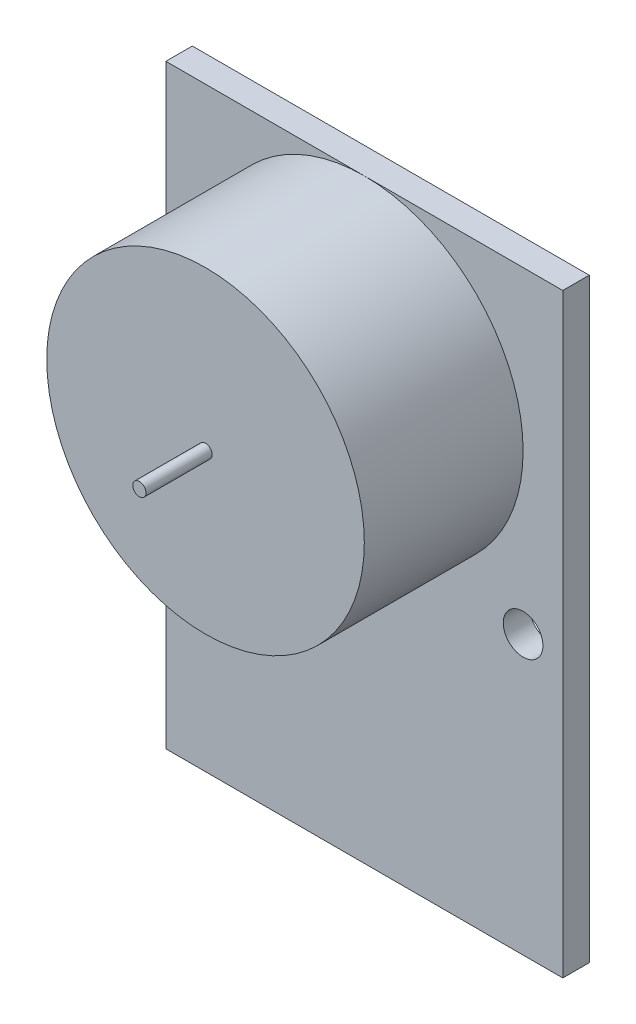
ISO-10303-21;
HEADER;
FILE_DESCRIPTION(('STEP AP214'),'2;1');
FILE_NAME('part.step','',(''),(''),'','','');
FILE_SCHEMA(('AUTOMOTIVE_DESIGN { 1 0 10303 214 1 1 1 1 }'));
ENDSEC;
DATA;
#1=APPLICATION_CONTEXT('core data for automotive mechanical design processes');
#2=APPLICATION_PROTOCOL_DEFINITION('international standard','automotive_design',2000,#1);
#3=PRODUCT_CONTEXT('',#1,'mechanical');
#4=PRODUCT('Part','Part','',(#3));
#5=PRODUCT_RELATED_PRODUCT_CATEGORY('part','',(#4));
#6=PRODUCT_DEFINITION_FORMATION('','',#4);
#7=PRODUCT_DEFINITION_CONTEXT('part definition',#1,'design');
#8=PRODUCT_DEFINITION('design','',#6,#7);
#9=PRODUCT_DEFINITION_SHAPE('','',#8);
#10=(LENGTH_UNIT() NAMED_UNIT(*) SI_UNIT(.MILLI.,.METRE.));
#11=(NAMED_UNIT(*) PLANE_ANGLE_UNIT() SI_UNIT($,.RADIAN.));
#12=(NAMED_UNIT(*) SI_UNIT($,.STERADIAN.) SOLID_ANGLE_UNIT());
#13=UNCERTAINTY_MEASURE_WITH_UNIT(LENGTH_MEASURE(1.E-05),#10,'distance_accuracy_value','');
#14=(GEOMETRIC_REPRESENTATION_CONTEXT(3) GLOBAL_UNCERTAINTY_ASSIGNED_CONTEXT((#13)) GLOBAL_UNIT_ASSIGNED_CONTEXT((#10,
#11,#12)) REPRESENTATION_CONTEXT('',''));
#15=CARTESIAN_POINT('',(0.,0.,0.));
#16=DIRECTION('',(0.,0.,1.));
#17=DIRECTION('',(1.,0.,0.));
#18=AXIS2_PLACEMENT_3D('',#15,#16,#17);
#19=CARTESIAN_POINT('',(15.,-22.5,-2.));
#20=DIRECTION('',(1.,0.,0.));
#21=DIRECTION('',(0.,0.,-1.));
#22=AXIS2_PLACEMENT_3D('',#19,#20,#21);
#23=PLANE('',#22);
#24=DIRECTION('',(0.,1.,0.));
#25=VECTOR('',#24,1.);
#26=CARTESIAN_POINT('',(15.,-22.5,0.));
#27=LINE('',#26,#25);
#28=CARTESIAN_POINT('',(15.,-22.5,0.));
#29=VERTEX_POINT('',#28);
#30=CARTESIAN_POINT('',(15.,22.5,0.));
#31=VERTEX_POINT('',#30);
#32=EDGE_CURVE('E93',#29,#31,#27,.T.);
#33=ORIENTED_EDGE('',*,*,#32,.F.);
#34=DIRECTION('',(0.,0.,1.));
#35=VECTOR('',#34,1.);
#36=CARTESIAN_POINT('',(15.,-22.5,-2.));
#37=LINE('',#36,#35);
#38=CARTESIAN_POINT('',(15.,-22.5,-2.));
#39=VERTEX_POINT('',#38);
#40=EDGE_CURVE('E11',#39,#29,#37,.T.);
#41=ORIENTED_EDGE('',*,*,#40,.F.);
#42=DIRECTION('',(0.,1.,0.));
#43=VECTOR('',#42,1.);
#44=CARTESIAN_POINT('',(15.,-22.5,-2.));
#45=LINE('',#44,#43);
#46=CARTESIAN_POINT('',(15.,22.5,-2.));
#47=VERTEX_POINT('',#46);
#48=EDGE_CURVE('E106',#39,#47,#45,.T.);
#49=ORIENTED_EDGE('',*,*,#48,.T.);
#50=DIRECTION('',(0.,0.,1.));
#51=VECTOR('',#50,1.);
#52=CARTESIAN_POINT('',(15.,22.5,-2.));
#53=LINE('',#52,#51);
#54=EDGE_CURVE('E39',#47,#31,#53,.T.);
#55=ORIENTED_EDGE('',*,*,#54,.T.);
#56=EDGE_LOOP('',(#33,#41,#49,#55));
#57=FACE_BOUND('',#56,.T.);
#58=ADVANCED_FACE('F36',(#57),#23,.T.);
#59=CARTESIAN_POINT('',(-15.,-22.5,-2.));
#60=DIRECTION('',(0.,-1.,0.));
#61=DIRECTION('',(0.,0.,-1.));
#62=AXIS2_PLACEMENT_3D('',#59,#60,#61);
#63=PLANE('',#62);
#64=DIRECTION('',(1.,0.,0.));
#65=VECTOR('',#64,1.);
#66=CARTESIAN_POINT('',(-15.,-22.5,0.));
#67=LINE('',#66,#65);
#68=CARTESIAN_POINT('',(-15.,-22.5,0.));
#69=VERTEX_POINT('',#68);
#70=EDGE_CURVE('E105',#69,#29,#67,.T.);
#71=ORIENTED_EDGE('',*,*,#70,.F.);
#72=DIRECTION('',(0.,0.,1.));
#73=VECTOR('',#72,1.);
#74=CARTESIAN_POINT('',(-15.,-22.5,-2.));
#75=LINE('',#74,#73);
#76=CARTESIAN_POINT('',(-15.,-22.5,-2.));
#77=VERTEX_POINT('',#76);
#78=EDGE_CURVE('E45',#77,#69,#75,.T.);
#79=ORIENTED_EDGE('',*,*,#78,.F.);
#80=DIRECTION('',(1.,0.,0.));
#81=VECTOR('',#80,1.);
#82=CARTESIAN_POINT('',(-15.,-22.5,-2.));
#83=LINE('',#82,#81);
#84=EDGE_CURVE('E108',#77,#39,#83,.T.);
#85=ORIENTED_EDGE('',*,*,#84,.T.);
#86=ORIENTED_EDGE('',*,*,#40,.T.);
#87=EDGE_LOOP('',(#71,#79,#85,#86));
#88=FACE_BOUND('',#87,.T.);
#89=ADVANCED_FACE('F166',(#88),#63,.T.);
#90=CARTESIAN_POINT('',(-15.,-22.5,-2.));
#91=DIRECTION('',(-1.,0.,0.));
#92=DIRECTION('',(0.,0.,1.));
#93=AXIS2_PLACEMENT_3D('',#90,#91,#92);
#94=PLANE('',#93);
#95=DIRECTION('',(0.,-1.,0.));
#96=VECTOR('',#95,1.);
#97=CARTESIAN_POINT('',(-15.,-22.5,0.));
#98=LINE('',#97,#96);
#99=CARTESIAN_POINT('',(-15.,22.5,0.));
#100=VERTEX_POINT('',#99);
#101=EDGE_CURVE('E94',#100,#69,#98,.T.);
#102=ORIENTED_EDGE('',*,*,#101,.F.);
#103=DIRECTION('',(0.,0.,1.));
#104=VECTOR('',#103,1.);
#105=CARTESIAN_POINT('',(-15.,22.5,-2.));
#106=LINE('',#105,#104);
#107=CARTESIAN_POINT('',(-15.,22.5,-2.));
#108=VERTEX_POINT('',#107);
#109=EDGE_CURVE('E99',#108,#100,#106,.T.);
#110=ORIENTED_EDGE('',*,*,#109,.F.);
#111=DIRECTION('',(0.,-1.,0.));
#112=VECTOR('',#111,1.);
#113=CARTESIAN_POINT('',(-15.,-22.5,-2.));
#114=LINE('',#113,#112);
#115=EDGE_CURVE('E109',#108,#77,#114,.T.);
#116=ORIENTED_EDGE('',*,*,#115,.T.);
#117=ORIENTED_EDGE('',*,*,#78,.T.);
#118=EDGE_LOOP('',(#102,#110,#116,#117));
#119=FACE_BOUND('',#118,.T.);
#120=ADVANCED_FACE('F170',(#119),#94,.T.);
#121=CARTESIAN_POINT('',(-15.,22.5,-2.));
#122=DIRECTION('',(0.,1.,0.));
#123=DIRECTION('',(0.,0.,1.));
#124=AXIS2_PLACEMENT_3D('',#121,#122,#123);
#125=PLANE('',#124);
#126=DIRECTION('',(-1.,0.,0.));
#127=VECTOR('',#126,1.);
#128=CARTESIAN_POINT('',(-15.,22.5,0.));
#129=LINE('',#128,#127);
#130=CARTESIAN_POINT('',(0.,22.5,0.));
#131=VERTEX_POINT('',#130);
#132=EDGE_CURVE('E87',#31,#131,#129,.T.);
#133=ORIENTED_EDGE('',*,*,#132,.F.);
#134=ORIENTED_EDGE('',*,*,#54,.F.);
#135=DIRECTION('',(-1.,0.,0.));
#136=VECTOR('',#135,1.);
#137=CARTESIAN_POINT('',(-15.,22.5,-2.));
#138=LINE('',#137,#136);
#139=EDGE_CURVE('E111',#47,#108,#138,.T.);
#140=ORIENTED_EDGE('',*,*,#139,.T.);
#141=ORIENTED_EDGE('',*,*,#109,.T.);
#142=EDGE_CURVE('E95',#131,#100,#129,.T.);
#143=ORIENTED_EDGE('',*,*,#142,.F.);
#144=EDGE_LOOP('',(#133,#134,#140,#141,#143));
#145=FACE_BOUND('',#144,.T.);
#146=ADVANCED_FACE('F98',(#145),#125,.T.);
#147=CARTESIAN_POINT('',(0.,0.,-2.));
#148=DIRECTION('',(0.,0.,-1.));
#149=DIRECTION('',(-1.,0.,0.));
#150=AXIS2_PLACEMENT_3D('',#147,#148,#149);
#151=PLANE('',#150);
#152=CARTESIAN_POINT('',(-12.,-1.50000000000005,-2.));
#153=DIRECTION('',(0.,0.,-1.));
#154=DIRECTION('',(-1.,0.,0.));
#155=AXIS2_PLACEMENT_3D('',#152,#153,#154);
#156=CIRCLE('',#155,1.5);
#157=CARTESIAN_POINT('',(-13.5,-1.50000000000005,-2.));
#158=VERTEX_POINT('',#157);
#159=EDGE_CURVE('E127',#158,#158,#156,.F.);
#160=ORIENTED_EDGE('',*,*,#159,.T.);
#161=EDGE_LOOP('',(#160));
#162=FACE_BOUND('',#161,.T.);
#163=CARTESIAN_POINT('',(12.,-1.50000000000005,-2.));
#164=DIRECTION('',(0.,0.,-1.));
#165=DIRECTION('',(-1.,0.,0.));
#166=AXIS2_PLACEMENT_3D('',#163,#164,#165);
#167=CIRCLE('',#166,1.5);
#168=CARTESIAN_POINT('',(10.5,-1.50000000000005,-2.));
#169=VERTEX_POINT('',#168);
#170=EDGE_CURVE('E120',#169,#169,#167,.F.);
#171=ORIENTED_EDGE('',*,*,#170,.T.);
#172=EDGE_LOOP('',(#171));
#173=FACE_BOUND('',#172,.T.);
#174=ORIENTED_EDGE('',*,*,#48,.F.);
#175=ORIENTED_EDGE('',*,*,#84,.F.);
#176=ORIENTED_EDGE('',*,*,#115,.F.);
#177=ORIENTED_EDGE('',*,*,#139,.F.);
#178=EDGE_LOOP('',(#174,#175,#176,#177));
#179=FACE_BOUND('',#178,.T.);
#180=ADVANCED_FACE('F161',(#162,#173,#179),#151,.T.);
#181=CARTESIAN_POINT('',(0.,0.,0.));
#182=DIRECTION('',(0.,0.,-1.));
#183=DIRECTION('',(-1.,0.,0.));
#184=AXIS2_PLACEMENT_3D('',#181,#182,#183);
#185=PLANE('',#184);
#186=CARTESIAN_POINT('',(-12.,-1.50000000000005,0.));
#187=DIRECTION('',(0.,0.,1.));
#188=DIRECTION('',(1.,0.,0.));
#189=AXIS2_PLACEMENT_3D('',#186,#187,#188);
#190=CIRCLE('',#189,1.5);
#191=CARTESIAN_POINT('',(-10.5,-1.50000000000005,0.));
#192=VERTEX_POINT('',#191);
#193=EDGE_CURVE('E117',#192,#192,#190,.T.);
#194=ORIENTED_EDGE('',*,*,#193,.F.);
#195=EDGE_LOOP('',(#194));
#196=FACE_BOUND('',#195,.T.);
#197=CARTESIAN_POINT('',(12.,-1.50000000000005,0.));
#198=DIRECTION('',(0.,0.,1.));
#199=DIRECTION('',(-1.,0.,0.));
#200=AXIS2_PLACEMENT_3D('',#197,#198,#199);
#201=CIRCLE('',#200,1.5);
#202=CARTESIAN_POINT('',(10.5,-1.50000000000005,0.));
#203=VERTEX_POINT('',#202);
#204=EDGE_CURVE('E123',#203,#203,#201,.T.);
#205=ORIENTED_EDGE('',*,*,#204,.F.);
#206=EDGE_LOOP('',(#205));
#207=FACE_BOUND('',#206,.T.);
#208=ORIENTED_EDGE('',*,*,#132,.T.);
#209=CARTESIAN_POINT('',(0.,10.5,0.));
#210=DIRECTION('',(0.,0.,1.));
#211=DIRECTION('',(1.,0.,0.));
#212=AXIS2_PLACEMENT_3D('',#209,#210,#211);
#213=CIRCLE('',#212,12.);
#214=EDGE_CURVE('E91',#131,#131,#213,.T.);
#215=ORIENTED_EDGE('',*,*,#214,.F.);
#216=ORIENTED_EDGE('',*,*,#142,.T.);
#217=ORIENTED_EDGE('',*,*,#101,.T.);
#218=ORIENTED_EDGE('',*,*,#70,.T.);
#219=ORIENTED_EDGE('',*,*,#32,.T.);
#220=EDGE_LOOP('',(#208,#215,#216,#217,#218,#219));
#221=FACE_BOUND('',#220,.T.);
#222=ADVANCED_FACE('F89',(#196,#207,#221),#185,.F.);
#223=CARTESIAN_POINT('',(0.,10.5,12.));
#224=DIRECTION('',(0.,0.,-1.));
#225=DIRECTION('',(-1.,0.,0.));
#226=AXIS2_PLACEMENT_3D('',#223,#224,#225);
#227=CYLINDRICAL_SURFACE('',#226,12.);
#228=CARTESIAN_POINT('',(0.,10.5,12.));
#229=DIRECTION('',(0.,0.,1.));
#230=DIRECTION('',(1.,0.,0.));
#231=AXIS2_PLACEMENT_3D('',#228,#229,#230);
#232=CIRCLE('',#231,12.);
#233=CARTESIAN_POINT('',(12.,10.5,12.));
#234=VERTEX_POINT('',#233);
#235=EDGE_CURVE('E100',#234,#234,#232,.T.);
#236=ORIENTED_EDGE('',*,*,#235,.F.);
#237=EDGE_LOOP('',(#236));
#238=FACE_BOUND('',#237,.T.);
#239=ORIENTED_EDGE('',*,*,#214,.T.);
#240=EDGE_LOOP('',(#239));
#241=FACE_BOUND('',#240,.T.);
#242=ADVANCED_FACE('F151',(#238,#241),#227,.T.);
#243=CARTESIAN_POINT('',(0.,10.5,12.));
#244=DIRECTION('',(0.,0.,1.));
#245=DIRECTION('',(1.,0.,0.));
#246=AXIS2_PLACEMENT_3D('',#243,#244,#245);
#247=PLANE('',#246);
#248=CARTESIAN_POINT('',(0.,10.5,12.));
#249=DIRECTION('',(0.,0.,1.));
#250=DIRECTION('',(1.,0.,0.));
#251=AXIS2_PLACEMENT_3D('',#248,#249,#250);
#252=CIRCLE('',#251,0.5);
#253=CARTESIAN_POINT('',(0.5,10.5,12.));
#254=VERTEX_POINT('',#253);
#255=EDGE_CURVE('E132',#254,#254,#252,.T.);
#256=ORIENTED_EDGE('',*,*,#255,.F.);
#257=EDGE_LOOP('',(#256));
#258=FACE_BOUND('',#257,.T.);
#259=ORIENTED_EDGE('',*,*,#235,.T.);
#260=EDGE_LOOP('',(#259));
#261=FACE_BOUND('',#260,.T.);
#262=ADVANCED_FACE('F147',(#258,#261),#247,.T.);
#263=CARTESIAN_POINT('',(12.,-1.50000000000005,-2.001));
#264=DIRECTION('',(0.,0.,1.));
#265=DIRECTION('',(1.,0.,0.));
#266=AXIS2_PLACEMENT_3D('',#263,#264,#265);
#267=CYLINDRICAL_SURFACE('',#266,1.5);
#268=ORIENTED_EDGE('',*,*,#170,.F.);
#269=EDGE_LOOP('',(#268));
#270=FACE_BOUND('',#269,.T.);
#271=ORIENTED_EDGE('',*,*,#204,.T.);
#272=EDGE_LOOP('',(#271));
#273=FACE_BOUND('',#272,.T.);
#274=ADVANCED_FACE('F150',(#270,#273),#267,.F.);
#275=CARTESIAN_POINT('',(-12.,-1.50000000000005,-2.001));
#276=DIRECTION('',(0.,0.,1.));
#277=DIRECTION('',(1.,0.,0.));
#278=AXIS2_PLACEMENT_3D('',#275,#276,#277);
#279=CYLINDRICAL_SURFACE('',#278,1.5);
#280=ORIENTED_EDGE('',*,*,#159,.F.);
#281=EDGE_LOOP('',(#280));
#282=FACE_BOUND('',#281,.T.);
#283=ORIENTED_EDGE('',*,*,#193,.T.);
#284=EDGE_LOOP('',(#283));
#285=FACE_BOUND('',#284,.T.);
#286=ADVANCED_FACE('F143',(#282,#285),#279,.F.);
#287=CARTESIAN_POINT('',(0.,10.5,17.));
#288=DIRECTION('',(0.,0.,-1.));
#289=DIRECTION('',(-1.,0.,0.));
#290=AXIS2_PLACEMENT_3D('',#287,#288,#289);
#291=CYLINDRICAL_SURFACE('',#290,0.5);
#292=CARTESIAN_POINT('',(0.,10.5,17.));
#293=DIRECTION('',(0.,0.,1.));
#294=DIRECTION('',(1.,0.,0.));
#295=AXIS2_PLACEMENT_3D('',#292,#293,#294);
#296=CIRCLE('',#295,0.5);
#297=CARTESIAN_POINT('',(0.5,10.5,17.));
#298=VERTEX_POINT('',#297);
#299=EDGE_CURVE('E124',#298,#298,#296,.T.);
#300=ORIENTED_EDGE('',*,*,#299,.F.);
#301=EDGE_LOOP('',(#300));
#302=FACE_BOUND('',#301,.T.);
#303=ORIENTED_EDGE('',*,*,#255,.T.);
#304=EDGE_LOOP('',(#303));
#305=FACE_BOUND('',#304,.T.);
#306=ADVANCED_FACE('F140',(#302,#305),#291,.T.);
#307=CARTESIAN_POINT('',(0.,10.5,17.));
#308=DIRECTION('',(0.,0.,1.));
#309=DIRECTION('',(1.,0.,0.));
#310=AXIS2_PLACEMENT_3D('',#307,#308,#309);
#311=PLANE('',#310);
#312=ORIENTED_EDGE('',*,*,#299,.T.);
#313=EDGE_LOOP('',(#312));
#314=FACE_BOUND('',#313,.T.);
#315=ADVANCED_FACE('F138',(#314),#311,.T.);
#316=CLOSED_SHELL('',(#58,#89,#120,#146,#180,#222,#242,#262,#274,#286,#306,#315));
#317=MANIFOLD_SOLID_BREP('B2',#316);
#318=ADVANCED_BREP_SHAPE_REPRESENTATION('',(#18,#317),#14);
#319=SHAPE_DEFINITION_REPRESENTATION(#9,#318);
ENDSEC;
END-ISO-10303-21;
